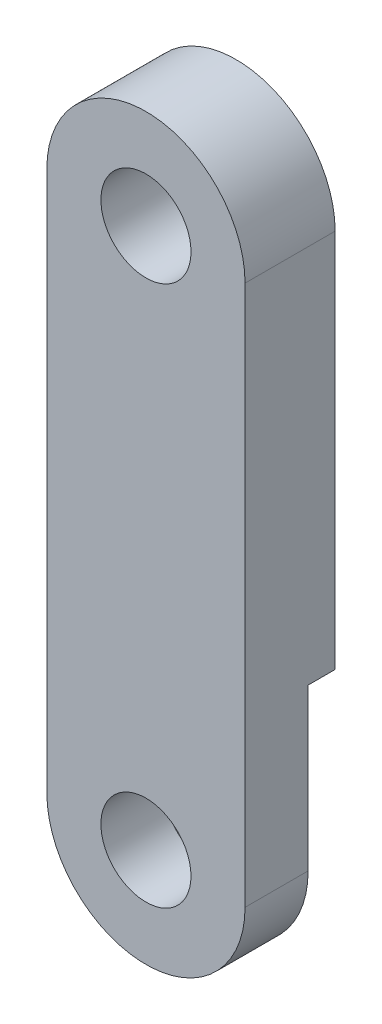
ISO-10303-21;
HEADER;
FILE_DESCRIPTION(('STEP AP214'),'2;1');
FILE_NAME('part.step','',(''),(''),'','','');
FILE_SCHEMA(('AUTOMOTIVE_DESIGN { 1 0 10303 214 1 1 1 1 }'));
ENDSEC;
DATA;
#1=APPLICATION_CONTEXT('core data for automotive mechanical design processes');
#2=APPLICATION_PROTOCOL_DEFINITION('international standard','automotive_design',2000,#1);
#3=PRODUCT_CONTEXT('',#1,'mechanical');
#4=PRODUCT('Part','Part','',(#3));
#5=PRODUCT_RELATED_PRODUCT_CATEGORY('part','',(#4));
#6=PRODUCT_DEFINITION_FORMATION('','',#4);
#7=PRODUCT_DEFINITION_CONTEXT('part definition',#1,'design');
#8=PRODUCT_DEFINITION('design','',#6,#7);
#9=PRODUCT_DEFINITION_SHAPE('','',#8);
#10=(LENGTH_UNIT() NAMED_UNIT(*) SI_UNIT(.MILLI.,.METRE.));
#11=(NAMED_UNIT(*) PLANE_ANGLE_UNIT() SI_UNIT($,.RADIAN.));
#12=(NAMED_UNIT(*) SI_UNIT($,.STERADIAN.) SOLID_ANGLE_UNIT());
#13=UNCERTAINTY_MEASURE_WITH_UNIT(LENGTH_MEASURE(1.E-05),#10,'distance_accuracy_value','');
#14=(GEOMETRIC_REPRESENTATION_CONTEXT(3) GLOBAL_UNCERTAINTY_ASSIGNED_CONTEXT((#13)) GLOBAL_UNIT_ASSIGNED_CONTEXT((#10,
#11,#12)) REPRESENTATION_CONTEXT('',''));
#15=CARTESIAN_POINT('',(0.,0.,0.));
#16=DIRECTION('',(0.,0.,1.));
#17=DIRECTION('',(1.,0.,0.));
#18=AXIS2_PLACEMENT_3D('',#15,#16,#17);
#19=CARTESIAN_POINT('',(0.,0.,10.));
#20=DIRECTION('',(0.,0.,1.));
#21=DIRECTION('',(1.,0.,0.));
#22=AXIS2_PLACEMENT_3D('',#19,#20,#21);
#23=PLANE('',#22);
#24=CARTESIAN_POINT('',(0.,0.,10.));
#25=DIRECTION('',(0.,0.,1.));
#26=DIRECTION('',(1.,0.,0.));
#27=AXIS2_PLACEMENT_3D('',#24,#25,#26);
#28=CIRCLE('',#27,5.);
#29=CARTESIAN_POINT('',(5.,0.,10.));
#30=VERTEX_POINT('',#29);
#31=EDGE_CURVE('E146',#30,#30,#28,.T.);
#32=ORIENTED_EDGE('',*,*,#31,.F.);
#33=EDGE_LOOP('',(#32));
#34=FACE_BOUND('',#33,.T.);
#35=CARTESIAN_POINT('',(0.,0.,10.));
#36=DIRECTION('',(0.,0.,1.));
#37=DIRECTION('',(1.,0.,0.));
#38=AXIS2_PLACEMENT_3D('',#35,#36,#37);
#39=CIRCLE('',#38,11.);
#40=CARTESIAN_POINT('',(-11.,0.,10.));
#41=VERTEX_POINT('',#40);
#42=CARTESIAN_POINT('',(11.,0.,10.));
#43=VERTEX_POINT('',#42);
#44=EDGE_CURVE('E153',#41,#43,#39,.T.);
#45=ORIENTED_EDGE('',*,*,#44,.T.);
#46=DIRECTION('',(0.,1.,0.));
#47=VECTOR('',#46,1.);
#48=CARTESIAN_POINT('',(11.,0.,10.));
#49=LINE('',#48,#47);
#50=CARTESIAN_POINT('',(11.,60.,10.));
#51=VERTEX_POINT('',#50);
#52=EDGE_CURVE('E87',#43,#51,#49,.T.);
#53=ORIENTED_EDGE('',*,*,#52,.T.);
#54=CARTESIAN_POINT('',(0.,60.,10.));
#55=DIRECTION('',(0.,0.,1.));
#56=DIRECTION('',(1.,0.,0.));
#57=AXIS2_PLACEMENT_3D('',#54,#55,#56);
#58=CIRCLE('',#57,11.);
#59=CARTESIAN_POINT('',(-11.,60.,10.));
#60=VERTEX_POINT('',#59);
#61=EDGE_CURVE('E156',#51,#60,#58,.T.);
#62=ORIENTED_EDGE('',*,*,#61,.T.);
#63=DIRECTION('',(0.,-1.,0.));
#64=VECTOR('',#63,1.);
#65=CARTESIAN_POINT('',(-11.,0.,10.));
#66=LINE('',#65,#64);
#67=EDGE_CURVE('E64',#60,#41,#66,.T.);
#68=ORIENTED_EDGE('',*,*,#67,.T.);
#69=EDGE_LOOP('',(#45,#53,#62,#68));
#70=FACE_BOUND('',#69,.T.);
#71=CARTESIAN_POINT('',(0.,60.,10.));
#72=DIRECTION('',(0.,0.,1.));
#73=DIRECTION('',(1.,0.,0.));
#74=AXIS2_PLACEMENT_3D('',#71,#72,#73);
#75=CIRCLE('',#74,5.);
#76=CARTESIAN_POINT('',(5.,60.,10.));
#77=VERTEX_POINT('',#76);
#78=EDGE_CURVE('E143',#77,#77,#75,.T.);
#79=ORIENTED_EDGE('',*,*,#78,.F.);
#80=EDGE_LOOP('',(#79));
#81=FACE_BOUND('',#80,.T.);
#82=ADVANCED_FACE('F39',(#34,#70,#81),#23,.T.);
#83=CARTESIAN_POINT('',(0.,0.,0.));
#84=DIRECTION('',(0.,0.,1.));
#85=DIRECTION('',(1.,0.,0.));
#86=AXIS2_PLACEMENT_3D('',#83,#84,#85);
#87=PLANE('',#86);
#88=DIRECTION('',(0.,1.,0.));
#89=VECTOR('',#88,1.);
#90=CARTESIAN_POINT('',(11.,0.,0.));
#91=LINE('',#90,#89);
#92=CARTESIAN_POINT('',(11.,17.8605710994918,0.));
#93=VERTEX_POINT('',#92);
#94=CARTESIAN_POINT('',(11.,60.,0.));
#95=VERTEX_POINT('',#94);
#96=EDGE_CURVE('E152',#93,#95,#91,.T.);
#97=ORIENTED_EDGE('',*,*,#96,.F.);
#98=DIRECTION('',(1.,0.,0.));
#99=VECTOR('',#98,1.);
#100=CARTESIAN_POINT('',(9.,17.8605710994918,0.));
#101=LINE('',#100,#99);
#102=CARTESIAN_POINT('',(9.,17.8605710994918,0.));
#103=VERTEX_POINT('',#102);
#104=EDGE_CURVE('E178',#103,#93,#101,.T.);
#105=ORIENTED_EDGE('',*,*,#104,.F.);
#106=CARTESIAN_POINT('',(0.,0.,0.));
#107=DIRECTION('',(0.,0.,-1.));
#108=DIRECTION('',(-1.,0.,0.));
#109=AXIS2_PLACEMENT_3D('',#106,#107,#108);
#110=CIRCLE('',#109,20.);
#111=CARTESIAN_POINT('',(-9.,17.8605710994918,0.));
#112=VERTEX_POINT('',#111);
#113=EDGE_CURVE('E176',#112,#103,#110,.T.);
#114=ORIENTED_EDGE('',*,*,#113,.F.);
#115=DIRECTION('',(1.,0.,0.));
#116=VECTOR('',#115,1.);
#117=CARTESIAN_POINT('',(-9.,17.8605710994918,0.));
#118=LINE('',#117,#116);
#119=CARTESIAN_POINT('',(-11.,17.8605710994918,0.));
#120=VERTEX_POINT('',#119);
#121=EDGE_CURVE('E174',#120,#112,#118,.T.);
#122=ORIENTED_EDGE('',*,*,#121,.F.);
#123=DIRECTION('',(0.,-1.,0.));
#124=VECTOR('',#123,1.);
#125=CARTESIAN_POINT('',(-11.,0.,0.));
#126=LINE('',#125,#124);
#127=CARTESIAN_POINT('',(-11.,60.,0.));
#128=VERTEX_POINT('',#127);
#129=EDGE_CURVE('E134',#128,#120,#126,.T.);
#130=ORIENTED_EDGE('',*,*,#129,.F.);
#131=CARTESIAN_POINT('',(0.,60.,0.));
#132=DIRECTION('',(0.,0.,1.));
#133=DIRECTION('',(1.,0.,0.));
#134=AXIS2_PLACEMENT_3D('',#131,#132,#133);
#135=CIRCLE('',#134,11.);
#136=EDGE_CURVE('E80',#95,#128,#135,.T.);
#137=ORIENTED_EDGE('',*,*,#136,.F.);
#138=EDGE_LOOP('',(#97,#105,#114,#122,#130,#137));
#139=FACE_BOUND('',#138,.T.);
#140=CARTESIAN_POINT('',(0.,60.,0.));
#141=DIRECTION('',(0.,0.,1.));
#142=DIRECTION('',(1.,0.,0.));
#143=AXIS2_PLACEMENT_3D('',#140,#141,#142);
#144=CIRCLE('',#143,5.);
#145=CARTESIAN_POINT('',(5.,60.,0.));
#146=VERTEX_POINT('',#145);
#147=EDGE_CURVE('E147',#146,#146,#144,.T.);
#148=ORIENTED_EDGE('',*,*,#147,.T.);
#149=EDGE_LOOP('',(#148));
#150=FACE_BOUND('',#149,.T.);
#151=ADVANCED_FACE('F170',(#139,#150),#87,.F.);
#152=CARTESIAN_POINT('',(0.,0.,10.));
#153=DIRECTION('',(0.,0.,-1.));
#154=DIRECTION('',(-1.,0.,0.));
#155=AXIS2_PLACEMENT_3D('',#152,#153,#154);
#156=CYLINDRICAL_SURFACE('',#155,11.);
#157=DIRECTION('',(0.,0.,-1.));
#158=VECTOR('',#157,1.);
#159=CARTESIAN_POINT('',(-11.,0.,10.));
#160=LINE('',#159,#158);
#161=CARTESIAN_POINT('',(-11.,0.,3.));
#162=VERTEX_POINT('',#161);
#163=EDGE_CURVE('E159',#41,#162,#160,.T.);
#164=ORIENTED_EDGE('',*,*,#163,.T.);
#165=CARTESIAN_POINT('',(0.,0.,3.));
#166=DIRECTION('',(0.,0.,-1.));
#167=DIRECTION('',(1.,0.,0.));
#168=AXIS2_PLACEMENT_3D('',#165,#166,#167);
#169=CIRCLE('',#168,11.);
#170=CARTESIAN_POINT('',(11.,0.,3.));
#171=VERTEX_POINT('',#170);
#172=EDGE_CURVE('E55',#171,#162,#169,.T.);
#173=ORIENTED_EDGE('',*,*,#172,.F.);
#174=DIRECTION('',(0.,0.,-1.));
#175=VECTOR('',#174,1.);
#176=CARTESIAN_POINT('',(11.,0.,10.));
#177=LINE('',#176,#175);
#178=EDGE_CURVE('E11',#43,#171,#177,.T.);
#179=ORIENTED_EDGE('',*,*,#178,.F.);
#180=ORIENTED_EDGE('',*,*,#44,.F.);
#181=EDGE_LOOP('',(#164,#173,#179,#180));
#182=FACE_BOUND('',#181,.T.);
#183=ADVANCED_FACE('F41',(#182),#156,.T.);
#184=CARTESIAN_POINT('',(11.,0.,10.));
#185=DIRECTION('',(-1.,0.,0.));
#186=DIRECTION('',(0.,0.,1.));
#187=AXIS2_PLACEMENT_3D('',#184,#185,#186);
#188=PLANE('',#187);
#189=DIRECTION('',(0.,-1.,0.));
#190=VECTOR('',#189,1.);
#191=CARTESIAN_POINT('',(11.,0.,3.));
#192=LINE('',#191,#190);
#193=CARTESIAN_POINT('',(11.,17.8605710994918,3.));
#194=VERTEX_POINT('',#193);
#195=EDGE_CURVE('E135',#194,#171,#192,.T.);
#196=ORIENTED_EDGE('',*,*,#195,.F.);
#197=DIRECTION('',(0.,0.,-1.));
#198=VECTOR('',#197,1.);
#199=CARTESIAN_POINT('',(11.,17.8605710994918,3.));
#200=LINE('',#199,#198);
#201=EDGE_CURVE('E183',#194,#93,#200,.T.);
#202=ORIENTED_EDGE('',*,*,#201,.T.);
#203=ORIENTED_EDGE('',*,*,#96,.T.);
#204=DIRECTION('',(0.,0.,-1.));
#205=VECTOR('',#204,1.);
#206=CARTESIAN_POINT('',(11.,60.,10.));
#207=LINE('',#206,#205);
#208=EDGE_CURVE('E48',#51,#95,#207,.T.);
#209=ORIENTED_EDGE('',*,*,#208,.F.);
#210=ORIENTED_EDGE('',*,*,#52,.F.);
#211=ORIENTED_EDGE('',*,*,#178,.T.);
#212=EDGE_LOOP('',(#196,#202,#203,#209,#210,#211));
#213=FACE_BOUND('',#212,.T.);
#214=ADVANCED_FACE('F194',(#213),#188,.F.);
#215=CARTESIAN_POINT('',(0.,60.,10.));
#216=DIRECTION('',(0.,0.,-1.));
#217=DIRECTION('',(-1.,0.,0.));
#218=AXIS2_PLACEMENT_3D('',#215,#216,#217);
#219=CYLINDRICAL_SURFACE('',#218,11.);
#220=ORIENTED_EDGE('',*,*,#136,.T.);
#221=DIRECTION('',(0.,0.,-1.));
#222=VECTOR('',#221,1.);
#223=CARTESIAN_POINT('',(-11.,60.,10.));
#224=LINE('',#223,#222);
#225=EDGE_CURVE('E164',#60,#128,#224,.T.);
#226=ORIENTED_EDGE('',*,*,#225,.F.);
#227=ORIENTED_EDGE('',*,*,#61,.F.);
#228=ORIENTED_EDGE('',*,*,#208,.T.);
#229=EDGE_LOOP('',(#220,#226,#227,#228));
#230=FACE_BOUND('',#229,.T.);
#231=ADVANCED_FACE('F167',(#230),#219,.T.);
#232=CARTESIAN_POINT('',(-11.,0.,10.));
#233=DIRECTION('',(1.,0.,0.));
#234=DIRECTION('',(0.,0.,-1.));
#235=AXIS2_PLACEMENT_3D('',#232,#233,#234);
#236=PLANE('',#235);
#237=ORIENTED_EDGE('',*,*,#129,.T.);
#238=DIRECTION('',(0.,0.,-1.));
#239=VECTOR('',#238,1.);
#240=CARTESIAN_POINT('',(-11.,17.8605710994918,3.));
#241=LINE('',#240,#239);
#242=CARTESIAN_POINT('',(-11.,17.8605710994918,3.));
#243=VERTEX_POINT('',#242);
#244=EDGE_CURVE('E119',#243,#120,#241,.T.);
#245=ORIENTED_EDGE('',*,*,#244,.F.);
#246=DIRECTION('',(0.,1.,0.));
#247=VECTOR('',#246,1.);
#248=CARTESIAN_POINT('',(-11.,17.8605710994918,3.));
#249=LINE('',#248,#247);
#250=EDGE_CURVE('E125',#162,#243,#249,.T.);
#251=ORIENTED_EDGE('',*,*,#250,.F.);
#252=ORIENTED_EDGE('',*,*,#163,.F.);
#253=ORIENTED_EDGE('',*,*,#67,.F.);
#254=ORIENTED_EDGE('',*,*,#225,.T.);
#255=EDGE_LOOP('',(#237,#245,#251,#252,#253,#254));
#256=FACE_BOUND('',#255,.T.);
#257=ADVANCED_FACE('F132',(#256),#236,.F.);
#258=CARTESIAN_POINT('',(0.,0.,10.));
#259=DIRECTION('',(0.,0.,-1.));
#260=DIRECTION('',(-1.,0.,0.));
#261=AXIS2_PLACEMENT_3D('',#258,#259,#260);
#262=CYLINDRICAL_SURFACE('',#261,5.);
#263=CARTESIAN_POINT('',(0.,0.,3.));
#264=DIRECTION('',(0.,0.,1.));
#265=DIRECTION('',(1.,0.,0.));
#266=AXIS2_PLACEMENT_3D('',#263,#264,#265);
#267=CIRCLE('',#266,5.);
#268=CARTESIAN_POINT('',(5.,0.,3.));
#269=VERTEX_POINT('',#268);
#270=EDGE_CURVE('E43',#269,#269,#267,.T.);
#271=ORIENTED_EDGE('',*,*,#270,.F.);
#272=EDGE_LOOP('',(#271));
#273=FACE_BOUND('',#272,.T.);
#274=ORIENTED_EDGE('',*,*,#31,.T.);
#275=EDGE_LOOP('',(#274));
#276=FACE_BOUND('',#275,.T.);
#277=ADVANCED_FACE('F207',(#273,#276),#262,.F.);
#278=CARTESIAN_POINT('',(0.,60.,10.));
#279=DIRECTION('',(0.,0.,-1.));
#280=DIRECTION('',(-1.,0.,0.));
#281=AXIS2_PLACEMENT_3D('',#278,#279,#280);
#282=CYLINDRICAL_SURFACE('',#281,5.);
#283=ORIENTED_EDGE('',*,*,#78,.T.);
#284=EDGE_LOOP('',(#283));
#285=FACE_BOUND('',#284,.T.);
#286=ORIENTED_EDGE('',*,*,#147,.F.);
#287=EDGE_LOOP('',(#286));
#288=FACE_BOUND('',#287,.T.);
#289=ADVANCED_FACE('F204',(#285,#288),#282,.F.);
#290=CARTESIAN_POINT('',(9.,17.8605710994918,3.));
#291=DIRECTION('',(0.,1.,0.));
#292=DIRECTION('',(0.,0.,1.));
#293=AXIS2_PLACEMENT_3D('',#290,#291,#292);
#294=PLANE('',#293);
#295=ORIENTED_EDGE('',*,*,#104,.T.);
#296=ORIENTED_EDGE('',*,*,#201,.F.);
#297=DIRECTION('',(1.,0.,0.));
#298=VECTOR('',#297,1.);
#299=CARTESIAN_POINT('',(9.,17.8605710994918,3.));
#300=LINE('',#299,#298);
#301=CARTESIAN_POINT('',(9.,17.8605710994918,3.));
#302=VERTEX_POINT('',#301);
#303=EDGE_CURVE('E139',#302,#194,#300,.T.);
#304=ORIENTED_EDGE('',*,*,#303,.F.);
#305=DIRECTION('',(0.,0.,-1.));
#306=VECTOR('',#305,1.);
#307=CARTESIAN_POINT('',(9.,17.8605710994918,3.));
#308=LINE('',#307,#306);
#309=EDGE_CURVE('E137',#302,#103,#308,.T.);
#310=ORIENTED_EDGE('',*,*,#309,.T.);
#311=EDGE_LOOP('',(#295,#296,#304,#310));
#312=FACE_BOUND('',#311,.T.);
#313=ADVANCED_FACE('F187',(#312),#294,.F.);
#314=CARTESIAN_POINT('',(0.,0.,3.));
#315=DIRECTION('',(0.,0.,-1.));
#316=DIRECTION('',(-1.,0.,0.));
#317=AXIS2_PLACEMENT_3D('',#314,#315,#316);
#318=CYLINDRICAL_SURFACE('',#317,20.);
#319=ORIENTED_EDGE('',*,*,#113,.T.);
#320=ORIENTED_EDGE('',*,*,#309,.F.);
#321=CARTESIAN_POINT('',(0.,0.,3.));
#322=DIRECTION('',(0.,0.,-1.));
#323=DIRECTION('',(-1.,0.,0.));
#324=AXIS2_PLACEMENT_3D('',#321,#322,#323);
#325=CIRCLE('',#324,20.);
#326=CARTESIAN_POINT('',(-9.,17.8605710994918,3.));
#327=VERTEX_POINT('',#326);
#328=EDGE_CURVE('E124',#327,#302,#325,.T.);
#329=ORIENTED_EDGE('',*,*,#328,.F.);
#330=DIRECTION('',(0.,0.,-1.));
#331=VECTOR('',#330,1.);
#332=CARTESIAN_POINT('',(-9.,17.8605710994918,3.));
#333=LINE('',#332,#331);
#334=EDGE_CURVE('E121',#327,#112,#333,.T.);
#335=ORIENTED_EDGE('',*,*,#334,.T.);
#336=EDGE_LOOP('',(#319,#320,#329,#335));
#337=FACE_BOUND('',#336,.T.);
#338=ADVANCED_FACE('F190',(#337),#318,.F.);
#339=CARTESIAN_POINT('',(-9.,17.8605710994918,3.));
#340=DIRECTION('',(0.,1.,0.));
#341=DIRECTION('',(0.,0.,1.));
#342=AXIS2_PLACEMENT_3D('',#339,#340,#341);
#343=PLANE('',#342);
#344=ORIENTED_EDGE('',*,*,#121,.T.);
#345=ORIENTED_EDGE('',*,*,#334,.F.);
#346=DIRECTION('',(1.,0.,0.));
#347=VECTOR('',#346,1.);
#348=CARTESIAN_POINT('',(-9.,17.8605710994918,3.));
#349=LINE('',#348,#347);
#350=EDGE_CURVE('E115',#243,#327,#349,.T.);
#351=ORIENTED_EDGE('',*,*,#350,.F.);
#352=ORIENTED_EDGE('',*,*,#244,.T.);
#353=EDGE_LOOP('',(#344,#345,#351,#352));
#354=FACE_BOUND('',#353,.T.);
#355=ADVANCED_FACE('F117',(#354),#343,.F.);
#356=CARTESIAN_POINT('',(0.,0.,3.));
#357=DIRECTION('',(0.,0.,1.));
#358=DIRECTION('',(1.,0.,0.));
#359=AXIS2_PLACEMENT_3D('',#356,#357,#358);
#360=PLANE('',#359);
#361=ORIENTED_EDGE('',*,*,#270,.T.);
#362=EDGE_LOOP('',(#361));
#363=FACE_BOUND('',#362,.T.);
#364=ORIENTED_EDGE('',*,*,#172,.T.);
#365=ORIENTED_EDGE('',*,*,#250,.T.);
#366=ORIENTED_EDGE('',*,*,#350,.T.);
#367=ORIENTED_EDGE('',*,*,#328,.T.);
#368=ORIENTED_EDGE('',*,*,#303,.T.);
#369=ORIENTED_EDGE('',*,*,#195,.T.);
#370=EDGE_LOOP('',(#364,#365,#366,#367,#368,#369));
#371=FACE_BOUND('',#370,.T.);
#372=ADVANCED_FACE('F127',(#363,#371),#360,.F.);
#373=CLOSED_SHELL('',(#82,#151,#183,#214,#231,#257,#277,#289,#313,#338,#355,#372));
#374=MANIFOLD_SOLID_BREP('B2',#373);
#375=ADVANCED_BREP_SHAPE_REPRESENTATION('',(#18,#374),#14);
#376=SHAPE_DEFINITION_REPRESENTATION(#9,#375);
ENDSEC;
END-ISO-10303-21;
